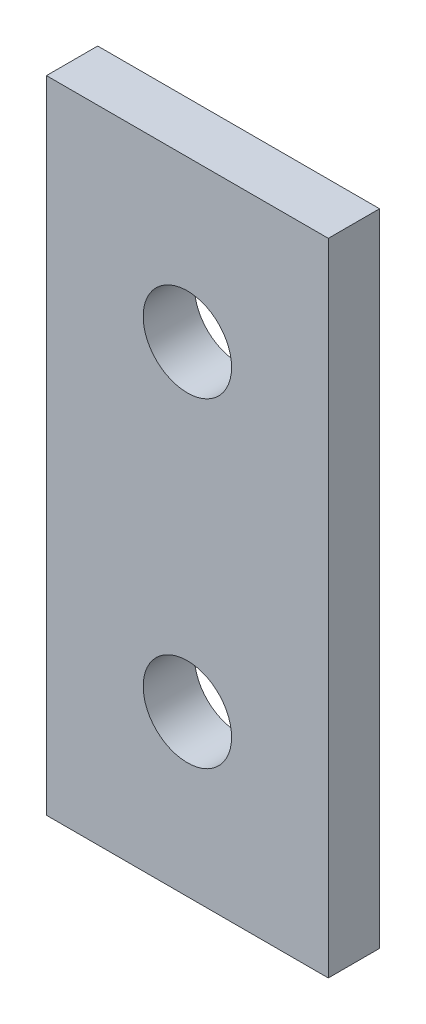
ISO-10303-21;
HEADER;
FILE_DESCRIPTION(('STEP AP214'),'2;1');
FILE_NAME('part.step','',(''),(''),'','','');
FILE_SCHEMA(('AUTOMOTIVE_DESIGN { 1 0 10303 214 1 1 1 1 }'));
ENDSEC;
DATA;
#1=APPLICATION_CONTEXT('core data for automotive mechanical design processes');
#2=APPLICATION_PROTOCOL_DEFINITION('international standard','automotive_design',2000,#1);
#3=PRODUCT_CONTEXT('',#1,'mechanical');
#4=PRODUCT('Part','Part','',(#3));
#5=PRODUCT_RELATED_PRODUCT_CATEGORY('part','',(#4));
#6=PRODUCT_DEFINITION_FORMATION('','',#4);
#7=PRODUCT_DEFINITION_CONTEXT('part definition',#1,'design');
#8=PRODUCT_DEFINITION('design','',#6,#7);
#9=PRODUCT_DEFINITION_SHAPE('','',#8);
#10=(LENGTH_UNIT() NAMED_UNIT(*) SI_UNIT(.MILLI.,.METRE.));
#11=(NAMED_UNIT(*) PLANE_ANGLE_UNIT() SI_UNIT($,.RADIAN.));
#12=(NAMED_UNIT(*) SI_UNIT($,.STERADIAN.) SOLID_ANGLE_UNIT());
#13=UNCERTAINTY_MEASURE_WITH_UNIT(LENGTH_MEASURE(1.E-05),#10,'distance_accuracy_value','');
#14=(GEOMETRIC_REPRESENTATION_CONTEXT(3) GLOBAL_UNCERTAINTY_ASSIGNED_CONTEXT((#13)) GLOBAL_UNIT_ASSIGNED_CONTEXT((#10,
#11,#12)) REPRESENTATION_CONTEXT('',''));
#15=CARTESIAN_POINT('',(0.,0.,0.));
#16=DIRECTION('',(0.,0.,1.));
#17=DIRECTION('',(1.,0.,0.));
#18=AXIS2_PLACEMENT_3D('',#15,#16,#17);
#19=CARTESIAN_POINT('',(-24.7333447880871,-47.7337800687285,4.));
#20=DIRECTION('',(0.,0.,1.));
#21=DIRECTION('',(1.,0.,0.));
#22=AXIS2_PLACEMENT_3D('',#19,#20,#21);
#23=PLANE('',#22);
#24=CARTESIAN_POINT('',(-13.7333447880871,-10.2337800687285,4.));
#25=DIRECTION('',(0.,0.,1.));
#26=DIRECTION('',(1.,0.,0.));
#27=AXIS2_PLACEMENT_3D('',#24,#25,#26);
#28=CIRCLE('',#27,3.45);
#29=CARTESIAN_POINT('',(-10.2833447880871,-10.2337800687285,4.));
#30=VERTEX_POINT('',#29);
#31=EDGE_CURVE('E100',#30,#30,#28,.T.);
#32=ORIENTED_EDGE('',*,*,#31,.F.);
#33=EDGE_LOOP('',(#32));
#34=FACE_BOUND('',#33,.T.);
#35=DIRECTION('',(0.,-1.,0.));
#36=VECTOR('',#35,1.);
#37=CARTESIAN_POINT('',(-24.7333447880871,2.26621993127148,4.));
#38=LINE('',#37,#36);
#39=CARTESIAN_POINT('',(-24.7333447880871,2.26621993127148,4.));
#40=VERTEX_POINT('',#39);
#41=CARTESIAN_POINT('',(-24.7333447880871,-47.7337800687285,4.));
#42=VERTEX_POINT('',#41);
#43=EDGE_CURVE('E85',#40,#42,#38,.T.);
#44=ORIENTED_EDGE('',*,*,#43,.T.);
#45=DIRECTION('',(1.,0.,0.));
#46=VECTOR('',#45,1.);
#47=CARTESIAN_POINT('',(-24.7333447880871,-47.7337800687285,4.));
#48=LINE('',#47,#46);
#49=CARTESIAN_POINT('',(-2.73334478808706,-47.7337800687285,4.));
#50=VERTEX_POINT('',#49);
#51=EDGE_CURVE('E80',#42,#50,#48,.T.);
#52=ORIENTED_EDGE('',*,*,#51,.T.);
#53=DIRECTION('',(0.,1.,0.));
#54=VECTOR('',#53,1.);
#55=CARTESIAN_POINT('',(-2.73334478808707,2.26621993127148,4.));
#56=LINE('',#55,#54);
#57=CARTESIAN_POINT('',(-2.73334478808707,2.26621993127148,4.));
#58=VERTEX_POINT('',#57);
#59=EDGE_CURVE('E83',#50,#58,#56,.T.);
#60=ORIENTED_EDGE('',*,*,#59,.T.);
#61=DIRECTION('',(-1.,0.,0.));
#62=VECTOR('',#61,1.);
#63=CARTESIAN_POINT('',(-24.7333447880871,2.26621993127148,4.));
#64=LINE('',#63,#62);
#65=EDGE_CURVE('E50',#58,#40,#64,.T.);
#66=ORIENTED_EDGE('',*,*,#65,.T.);
#67=EDGE_LOOP('',(#44,#52,#60,#66));
#68=FACE_BOUND('',#67,.T.);
#69=CARTESIAN_POINT('',(-13.7333447880871,-35.2337800687285,4.));
#70=DIRECTION('',(0.,0.,1.));
#71=DIRECTION('',(1.,0.,0.));
#72=AXIS2_PLACEMENT_3D('',#69,#70,#71);
#73=CIRCLE('',#72,3.45);
#74=CARTESIAN_POINT('',(-10.2833447880871,-35.2337800687285,4.));
#75=VERTEX_POINT('',#74);
#76=EDGE_CURVE('E115',#75,#75,#73,.T.);
#77=ORIENTED_EDGE('',*,*,#76,.F.);
#78=EDGE_LOOP('',(#77));
#79=FACE_BOUND('',#78,.T.);
#80=ADVANCED_FACE('F33',(#34,#68,#79),#23,.T.);
#81=CARTESIAN_POINT('',(-24.7333447880871,-47.7337800687285,0.));
#82=DIRECTION('',(0.,0.,1.));
#83=DIRECTION('',(1.,0.,0.));
#84=AXIS2_PLACEMENT_3D('',#81,#82,#83);
#85=PLANE('',#84);
#86=CARTESIAN_POINT('',(-13.7333447880871,-10.2337800687285,0.));
#87=DIRECTION('',(0.,0.,1.));
#88=DIRECTION('',(1.,0.,0.));
#89=AXIS2_PLACEMENT_3D('',#86,#87,#88);
#90=CIRCLE('',#89,3.45);
#91=CARTESIAN_POINT('',(-10.2833447880871,-10.2337800687285,0.));
#92=VERTEX_POINT('',#91);
#93=EDGE_CURVE('E112',#92,#92,#90,.T.);
#94=ORIENTED_EDGE('',*,*,#93,.T.);
#95=EDGE_LOOP('',(#94));
#96=FACE_BOUND('',#95,.T.);
#97=DIRECTION('',(0.,-1.,0.));
#98=VECTOR('',#97,1.);
#99=CARTESIAN_POINT('',(-24.7333447880871,2.26621993127148,0.));
#100=LINE('',#99,#98);
#101=CARTESIAN_POINT('',(-24.7333447880871,2.26621993127148,0.));
#102=VERTEX_POINT('',#101);
#103=CARTESIAN_POINT('',(-24.7333447880871,-47.7337800687285,0.));
#104=VERTEX_POINT('',#103);
#105=EDGE_CURVE('E97',#102,#104,#100,.T.);
#106=ORIENTED_EDGE('',*,*,#105,.F.);
#107=DIRECTION('',(-1.,0.,0.));
#108=VECTOR('',#107,1.);
#109=CARTESIAN_POINT('',(-24.7333447880871,2.26621993127148,0.));
#110=LINE('',#109,#108);
#111=CARTESIAN_POINT('',(-2.73334478808707,2.26621993127148,0.));
#112=VERTEX_POINT('',#111);
#113=EDGE_CURVE('E73',#112,#102,#110,.T.);
#114=ORIENTED_EDGE('',*,*,#113,.F.);
#115=DIRECTION('',(0.,1.,0.));
#116=VECTOR('',#115,1.);
#117=CARTESIAN_POINT('',(-2.73334478808707,2.26621993127148,0.));
#118=LINE('',#117,#116);
#119=CARTESIAN_POINT('',(-2.73334478808706,-47.7337800687285,0.));
#120=VERTEX_POINT('',#119);
#121=EDGE_CURVE('E67',#120,#112,#118,.T.);
#122=ORIENTED_EDGE('',*,*,#121,.F.);
#123=DIRECTION('',(1.,0.,0.));
#124=VECTOR('',#123,1.);
#125=CARTESIAN_POINT('',(-24.7333447880871,-47.7337800687285,0.));
#126=LINE('',#125,#124);
#127=EDGE_CURVE('E89',#104,#120,#126,.T.);
#128=ORIENTED_EDGE('',*,*,#127,.F.);
#129=EDGE_LOOP('',(#106,#114,#122,#128));
#130=FACE_BOUND('',#129,.T.);
#131=CARTESIAN_POINT('',(-13.7333447880871,-35.2337800687285,0.));
#132=DIRECTION('',(0.,0.,1.));
#133=DIRECTION('',(1.,0.,0.));
#134=AXIS2_PLACEMENT_3D('',#131,#132,#133);
#135=CIRCLE('',#134,3.45);
#136=CARTESIAN_POINT('',(-10.2833447880871,-35.2337800687285,0.));
#137=VERTEX_POINT('',#136);
#138=EDGE_CURVE('E118',#137,#137,#135,.T.);
#139=ORIENTED_EDGE('',*,*,#138,.T.);
#140=EDGE_LOOP('',(#139));
#141=FACE_BOUND('',#140,.T.);
#142=ADVANCED_FACE('F108',(#96,#130,#141),#85,.F.);
#143=CARTESIAN_POINT('',(-24.7333447880871,2.26621993127148,4.));
#144=DIRECTION('',(1.,0.,0.));
#145=DIRECTION('',(0.,1.,0.));
#146=AXIS2_PLACEMENT_3D('',#143,#144,#145);
#147=PLANE('',#146);
#148=ORIENTED_EDGE('',*,*,#105,.T.);
#149=DIRECTION('',(0.,0.,-1.));
#150=VECTOR('',#149,1.);
#151=CARTESIAN_POINT('',(-24.7333447880871,-47.7337800687285,4.));
#152=LINE('',#151,#150);
#153=EDGE_CURVE('E11',#42,#104,#152,.T.);
#154=ORIENTED_EDGE('',*,*,#153,.F.);
#155=ORIENTED_EDGE('',*,*,#43,.F.);
#156=DIRECTION('',(0.,0.,-1.));
#157=VECTOR('',#156,1.);
#158=CARTESIAN_POINT('',(-24.7333447880871,2.26621993127148,4.));
#159=LINE('',#158,#157);
#160=EDGE_CURVE('E93',#40,#102,#159,.T.);
#161=ORIENTED_EDGE('',*,*,#160,.T.);
#162=EDGE_LOOP('',(#148,#154,#155,#161));
#163=FACE_BOUND('',#162,.T.);
#164=ADVANCED_FACE('F35',(#163),#147,.F.);
#165=CARTESIAN_POINT('',(-24.7333447880871,-47.7337800687285,4.));
#166=DIRECTION('',(0.,1.,0.));
#167=DIRECTION('',(0.,0.,1.));
#168=AXIS2_PLACEMENT_3D('',#165,#166,#167);
#169=PLANE('',#168);
#170=ORIENTED_EDGE('',*,*,#127,.T.);
#171=DIRECTION('',(0.,0.,-1.));
#172=VECTOR('',#171,1.);
#173=CARTESIAN_POINT('',(-2.73334478808706,-47.7337800687285,4.));
#174=LINE('',#173,#172);
#175=EDGE_CURVE('E42',#50,#120,#174,.T.);
#176=ORIENTED_EDGE('',*,*,#175,.F.);
#177=ORIENTED_EDGE('',*,*,#51,.F.);
#178=ORIENTED_EDGE('',*,*,#153,.T.);
#179=EDGE_LOOP('',(#170,#176,#177,#178));
#180=FACE_BOUND('',#179,.T.);
#181=ADVANCED_FACE('F88',(#180),#169,.F.);
#182=CARTESIAN_POINT('',(-2.73334478808707,2.26621993127148,4.));
#183=DIRECTION('',(-1.,0.,0.));
#184=DIRECTION('',(0.,-1.,0.));
#185=AXIS2_PLACEMENT_3D('',#182,#183,#184);
#186=PLANE('',#185);
#187=ORIENTED_EDGE('',*,*,#121,.T.);
#188=DIRECTION('',(0.,0.,-1.));
#189=VECTOR('',#188,1.);
#190=CARTESIAN_POINT('',(-2.73334478808707,2.26621993127148,4.));
#191=LINE('',#190,#189);
#192=EDGE_CURVE('E90',#58,#112,#191,.T.);
#193=ORIENTED_EDGE('',*,*,#192,.F.);
#194=ORIENTED_EDGE('',*,*,#59,.F.);
#195=ORIENTED_EDGE('',*,*,#175,.T.);
#196=EDGE_LOOP('',(#187,#193,#194,#195));
#197=FACE_BOUND('',#196,.T.);
#198=ADVANCED_FACE('F91',(#197),#186,.F.);
#199=CARTESIAN_POINT('',(-24.7333447880871,2.26621993127148,4.));
#200=DIRECTION('',(0.,-1.,0.));
#201=DIRECTION('',(0.,0.,-1.));
#202=AXIS2_PLACEMENT_3D('',#199,#200,#201);
#203=PLANE('',#202);
#204=ORIENTED_EDGE('',*,*,#113,.T.);
#205=ORIENTED_EDGE('',*,*,#160,.F.);
#206=ORIENTED_EDGE('',*,*,#65,.F.);
#207=ORIENTED_EDGE('',*,*,#192,.T.);
#208=EDGE_LOOP('',(#204,#205,#206,#207));
#209=FACE_BOUND('',#208,.T.);
#210=ADVANCED_FACE('F105',(#209),#203,.F.);
#211=CARTESIAN_POINT('',(-13.7333447880871,-10.2337800687285,4.));
#212=DIRECTION('',(0.,0.,-1.));
#213=DIRECTION('',(-1.,0.,0.));
#214=AXIS2_PLACEMENT_3D('',#211,#212,#213);
#215=CYLINDRICAL_SURFACE('',#214,3.45);
#216=ORIENTED_EDGE('',*,*,#31,.T.);
#217=EDGE_LOOP('',(#216));
#218=FACE_BOUND('',#217,.T.);
#219=ORIENTED_EDGE('',*,*,#93,.F.);
#220=EDGE_LOOP('',(#219));
#221=FACE_BOUND('',#220,.T.);
#222=ADVANCED_FACE('F136',(#218,#221),#215,.F.);
#223=CARTESIAN_POINT('',(-13.7333447880871,-35.2337800687285,4.));
#224=DIRECTION('',(0.,0.,-1.));
#225=DIRECTION('',(-1.,0.,0.));
#226=AXIS2_PLACEMENT_3D('',#223,#224,#225);
#227=CYLINDRICAL_SURFACE('',#226,3.45);
#228=ORIENTED_EDGE('',*,*,#76,.T.);
#229=EDGE_LOOP('',(#228));
#230=FACE_BOUND('',#229,.T.);
#231=ORIENTED_EDGE('',*,*,#138,.F.);
#232=EDGE_LOOP('',(#231));
#233=FACE_BOUND('',#232,.T.);
#234=ADVANCED_FACE('F124',(#230,#233),#227,.F.);
#235=CLOSED_SHELL('',(#80,#142,#164,#181,#198,#210,#222,#234));
#236=MANIFOLD_SOLID_BREP('B2',#235);
#237=ADVANCED_BREP_SHAPE_REPRESENTATION('',(#18,#236),#14);
#238=SHAPE_DEFINITION_REPRESENTATION(#9,#237);
ENDSEC;
END-ISO-10303-21;
